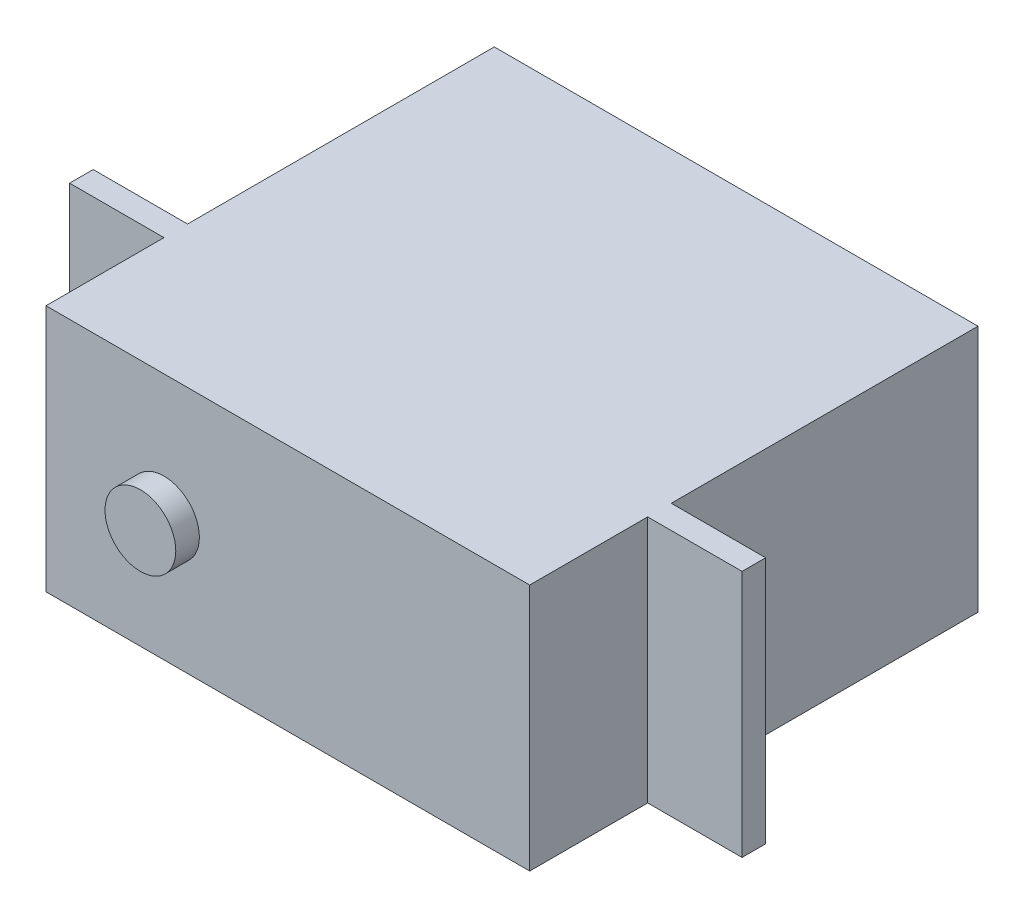
ISO-10303-21;
HEADER;
FILE_DESCRIPTION(('STEP AP214'),'2;1');
FILE_NAME('part.step','',(''),(''),'','','');
FILE_SCHEMA(('AUTOMOTIVE_DESIGN { 1 0 10303 214 1 1 1 1 }'));
ENDSEC;
DATA;
#1=APPLICATION_CONTEXT('core data for automotive mechanical design processes');
#2=APPLICATION_PROTOCOL_DEFINITION('international standard','automotive_design',2000,#1);
#3=PRODUCT_CONTEXT('',#1,'mechanical');
#4=PRODUCT('Part','Part','',(#3));
#5=PRODUCT_RELATED_PRODUCT_CATEGORY('part','',(#4));
#6=PRODUCT_DEFINITION_FORMATION('','',#4);
#7=PRODUCT_DEFINITION_CONTEXT('part definition',#1,'design');
#8=PRODUCT_DEFINITION('design','',#6,#7);
#9=PRODUCT_DEFINITION_SHAPE('','',#8);
#10=(LENGTH_UNIT() NAMED_UNIT(*) SI_UNIT(.MILLI.,.METRE.));
#11=(NAMED_UNIT(*) PLANE_ANGLE_UNIT() SI_UNIT($,.RADIAN.));
#12=(NAMED_UNIT(*) SI_UNIT($,.STERADIAN.) SOLID_ANGLE_UNIT());
#13=UNCERTAINTY_MEASURE_WITH_UNIT(LENGTH_MEASURE(1.E-05),#10,'distance_accuracy_value','');
#14=(GEOMETRIC_REPRESENTATION_CONTEXT(3) GLOBAL_UNCERTAINTY_ASSIGNED_CONTEXT((#13)) GLOBAL_UNIT_ASSIGNED_CONTEXT((#10,
#11,#12)) REPRESENTATION_CONTEXT('',''));
#15=CARTESIAN_POINT('',(0.,0.,0.));
#16=DIRECTION('',(0.,0.,1.));
#17=DIRECTION('',(1.,0.,0.));
#18=AXIS2_PLACEMENT_3D('',#15,#16,#17);
#19=CARTESIAN_POINT('',(-20.5,-10.5,32.9402739726027));
#20=DIRECTION('',(-1.,0.,0.));
#21=DIRECTION('',(0.,0.,1.));
#22=AXIS2_PLACEMENT_3D('',#19,#20,#21);
#23=PLANE('',#22);
#24=DIRECTION('',(0.,0.,1.));
#25=VECTOR('',#24,1.);
#26=CARTESIAN_POINT('',(-20.5,10.5,32.9402739726027));
#27=LINE('',#26,#25);
#28=CARTESIAN_POINT('',(-20.5,10.5,22.9402739726027));
#29=VERTEX_POINT('',#28);
#30=CARTESIAN_POINT('',(-20.5,10.5,32.9402739726027));
#31=VERTEX_POINT('',#30);
#32=EDGE_CURVE('E145',#29,#31,#27,.T.);
#33=ORIENTED_EDGE('',*,*,#32,.F.);
#34=DIRECTION('',(0.,1.,0.));
#35=VECTOR('',#34,1.);
#36=CARTESIAN_POINT('',(-20.5,-10.5,22.9402739726027));
#37=LINE('',#36,#35);
#38=CARTESIAN_POINT('',(-20.5,-10.5,22.9402739726027));
#39=VERTEX_POINT('',#38);
#40=EDGE_CURVE('E31',#39,#29,#37,.T.);
#41=ORIENTED_EDGE('',*,*,#40,.F.);
#42=DIRECTION('',(0.,0.,1.));
#43=VECTOR('',#42,1.);
#44=CARTESIAN_POINT('',(-20.5,-10.5,32.9402739726027));
#45=LINE('',#44,#43);
#46=CARTESIAN_POINT('',(-20.5,-10.5,32.9402739726027));
#47=VERTEX_POINT('',#46);
#48=EDGE_CURVE('E136',#39,#47,#45,.T.);
#49=ORIENTED_EDGE('',*,*,#48,.T.);
#50=DIRECTION('',(0.,1.,0.));
#51=VECTOR('',#50,1.);
#52=CARTESIAN_POINT('',(-20.5,-10.5,32.9402739726027));
#53=LINE('',#52,#51);
#54=EDGE_CURVE('E23',#47,#31,#53,.T.);
#55=ORIENTED_EDGE('',*,*,#54,.T.);
#56=EDGE_LOOP('',(#33,#41,#49,#55));
#57=FACE_BOUND('',#56,.T.);
#58=ADVANCED_FACE('F15',(#57),#23,.T.);
#59=CARTESIAN_POINT('',(-20.5,-10.5,32.9402739726027));
#60=DIRECTION('',(0.,0.,1.));
#61=DIRECTION('',(1.,0.,0.));
#62=AXIS2_PLACEMENT_3D('',#59,#60,#61);
#63=PLANE('',#62);
#64=CARTESIAN_POINT('',(-10.5,0.,32.9402739726027));
#65=DIRECTION('',(0.,0.,1.));
#66=DIRECTION('',(1.,0.,0.));
#67=AXIS2_PLACEMENT_3D('',#64,#65,#66);
#68=CIRCLE('',#67,3.);
#69=CARTESIAN_POINT('',(-7.5,0.,32.9402739726027));
#70=VERTEX_POINT('',#69);
#71=EDGE_CURVE('E9',#70,#70,#68,.T.);
#72=ORIENTED_EDGE('',*,*,#71,.F.);
#73=EDGE_LOOP('',(#72));
#74=FACE_BOUND('',#73,.T.);
#75=DIRECTION('',(1.,0.,0.));
#76=VECTOR('',#75,1.);
#77=CARTESIAN_POINT('',(-20.5,10.5,32.9402739726027));
#78=LINE('',#77,#76);
#79=CARTESIAN_POINT('',(20.5,10.5,32.9402739726027));
#80=VERTEX_POINT('',#79);
#81=EDGE_CURVE('E140',#31,#80,#78,.T.);
#82=ORIENTED_EDGE('',*,*,#81,.F.);
#83=ORIENTED_EDGE('',*,*,#54,.F.);
#84=DIRECTION('',(1.,0.,0.));
#85=VECTOR('',#84,1.);
#86=CARTESIAN_POINT('',(-20.5,-10.5,32.9402739726027));
#87=LINE('',#86,#85);
#88=CARTESIAN_POINT('',(20.5,-10.5,32.9402739726027));
#89=VERTEX_POINT('',#88);
#90=EDGE_CURVE('E138',#47,#89,#87,.T.);
#91=ORIENTED_EDGE('',*,*,#90,.T.);
#92=DIRECTION('',(0.,1.,0.));
#93=VECTOR('',#92,1.);
#94=CARTESIAN_POINT('',(20.5,-10.5,32.9402739726027));
#95=LINE('',#94,#93);
#96=EDGE_CURVE('E199',#89,#80,#95,.T.);
#97=ORIENTED_EDGE('',*,*,#96,.T.);
#98=EDGE_LOOP('',(#82,#83,#91,#97));
#99=FACE_BOUND('',#98,.T.);
#100=ADVANCED_FACE('F200',(#74,#99),#63,.T.);
#101=CARTESIAN_POINT('',(20.5,-10.5,32.9402739726027));
#102=DIRECTION('',(1.,0.,0.));
#103=DIRECTION('',(0.,0.,-1.));
#104=AXIS2_PLACEMENT_3D('',#101,#102,#103);
#105=PLANE('',#104);
#106=DIRECTION('',(0.,0.,-1.));
#107=VECTOR('',#106,1.);
#108=CARTESIAN_POINT('',(20.5,10.5,32.9402739726027));
#109=LINE('',#108,#107);
#110=CARTESIAN_POINT('',(20.5,10.5,22.9402739726027));
#111=VERTEX_POINT('',#110);
#112=EDGE_CURVE('E144',#80,#111,#109,.T.);
#113=ORIENTED_EDGE('',*,*,#112,.F.);
#114=ORIENTED_EDGE('',*,*,#96,.F.);
#115=DIRECTION('',(0.,0.,-1.));
#116=VECTOR('',#115,1.);
#117=CARTESIAN_POINT('',(20.5,-10.5,32.9402739726027));
#118=LINE('',#117,#116);
#119=CARTESIAN_POINT('',(20.5,-10.5,22.9402739726027));
#120=VERTEX_POINT('',#119);
#121=EDGE_CURVE('E208',#89,#120,#118,.T.);
#122=ORIENTED_EDGE('',*,*,#121,.T.);
#123=DIRECTION('',(0.,1.,0.));
#124=VECTOR('',#123,1.);
#125=CARTESIAN_POINT('',(20.5,-10.5,22.9402739726027));
#126=LINE('',#125,#124);
#127=EDGE_CURVE('E197',#120,#111,#126,.T.);
#128=ORIENTED_EDGE('',*,*,#127,.T.);
#129=EDGE_LOOP('',(#113,#114,#122,#128));
#130=FACE_BOUND('',#129,.T.);
#131=ADVANCED_FACE('F250',(#130),#105,.T.);
#132=CARTESIAN_POINT('',(20.5,-10.5,22.9402739726027));
#133=DIRECTION('',(0.,0.,1.));
#134=DIRECTION('',(1.,0.,0.));
#135=AXIS2_PLACEMENT_3D('',#132,#133,#134);
#136=PLANE('',#135);
#137=DIRECTION('',(1.,0.,0.));
#138=VECTOR('',#137,1.);
#139=CARTESIAN_POINT('',(20.5,10.5,22.9402739726027));
#140=LINE('',#139,#138);
#141=CARTESIAN_POINT('',(28.5,10.5,22.9402739726027));
#142=VERTEX_POINT('',#141);
#143=EDGE_CURVE('E149',#111,#142,#140,.T.);
#144=ORIENTED_EDGE('',*,*,#143,.F.);
#145=ORIENTED_EDGE('',*,*,#127,.F.);
#146=DIRECTION('',(1.,0.,0.));
#147=VECTOR('',#146,1.);
#148=CARTESIAN_POINT('',(20.5,-10.5,22.9402739726027));
#149=LINE('',#148,#147);
#150=CARTESIAN_POINT('',(28.5,-10.5,22.9402739726027));
#151=VERTEX_POINT('',#150);
#152=EDGE_CURVE('E210',#120,#151,#149,.T.);
#153=ORIENTED_EDGE('',*,*,#152,.T.);
#154=DIRECTION('',(0.,1.,0.));
#155=VECTOR('',#154,1.);
#156=CARTESIAN_POINT('',(28.5,-10.5,22.9402739726027));
#157=LINE('',#156,#155);
#158=EDGE_CURVE('E195',#151,#142,#157,.T.);
#159=ORIENTED_EDGE('',*,*,#158,.T.);
#160=EDGE_LOOP('',(#144,#145,#153,#159));
#161=FACE_BOUND('',#160,.T.);
#162=ADVANCED_FACE('F248',(#161),#136,.T.);
#163=CARTESIAN_POINT('',(28.5,-10.5,22.9402739726027));
#164=DIRECTION('',(1.,0.,0.));
#165=DIRECTION('',(0.,0.,-1.));
#166=AXIS2_PLACEMENT_3D('',#163,#164,#165);
#167=PLANE('',#166);
#168=DIRECTION('',(0.,0.,-1.));
#169=VECTOR('',#168,1.);
#170=CARTESIAN_POINT('',(28.5,10.5,22.9402739726027));
#171=LINE('',#170,#169);
#172=CARTESIAN_POINT('',(28.5,10.5,20.9402739726027));
#173=VERTEX_POINT('',#172);
#174=EDGE_CURVE('E153',#142,#173,#171,.T.);
#175=ORIENTED_EDGE('',*,*,#174,.F.);
#176=ORIENTED_EDGE('',*,*,#158,.F.);
#177=DIRECTION('',(0.,0.,-1.));
#178=VECTOR('',#177,1.);
#179=CARTESIAN_POINT('',(28.5,-10.5,22.9402739726027));
#180=LINE('',#179,#178);
#181=CARTESIAN_POINT('',(28.5,-10.5,20.9402739726027));
#182=VERTEX_POINT('',#181);
#183=EDGE_CURVE('E216',#151,#182,#180,.T.);
#184=ORIENTED_EDGE('',*,*,#183,.T.);
#185=DIRECTION('',(0.,1.,0.));
#186=VECTOR('',#185,1.);
#187=CARTESIAN_POINT('',(28.5,-10.5,20.9402739726027));
#188=LINE('',#187,#186);
#189=EDGE_CURVE('E193',#182,#173,#188,.T.);
#190=ORIENTED_EDGE('',*,*,#189,.T.);
#191=EDGE_LOOP('',(#175,#176,#184,#190));
#192=FACE_BOUND('',#191,.T.);
#193=ADVANCED_FACE('F245',(#192),#167,.T.);
#194=CARTESIAN_POINT('',(28.5,-10.5,20.9402739726027));
#195=DIRECTION('',(0.,0.,-1.));
#196=DIRECTION('',(-1.,0.,0.));
#197=AXIS2_PLACEMENT_3D('',#194,#195,#196);
#198=PLANE('',#197);
#199=DIRECTION('',(-1.,0.,0.));
#200=VECTOR('',#199,1.);
#201=CARTESIAN_POINT('',(28.5,10.5,20.9402739726027));
#202=LINE('',#201,#200);
#203=CARTESIAN_POINT('',(20.5,10.5,20.9402739726027));
#204=VERTEX_POINT('',#203);
#205=EDGE_CURVE('E157',#173,#204,#202,.T.);
#206=ORIENTED_EDGE('',*,*,#205,.F.);
#207=ORIENTED_EDGE('',*,*,#189,.F.);
#208=DIRECTION('',(-1.,0.,0.));
#209=VECTOR('',#208,1.);
#210=CARTESIAN_POINT('',(28.5,-10.5,20.9402739726027));
#211=LINE('',#210,#209);
#212=CARTESIAN_POINT('',(20.5,-10.5,20.9402739726027));
#213=VERTEX_POINT('',#212);
#214=EDGE_CURVE('E219',#182,#213,#211,.T.);
#215=ORIENTED_EDGE('',*,*,#214,.T.);
#216=DIRECTION('',(0.,1.,0.));
#217=VECTOR('',#216,1.);
#218=CARTESIAN_POINT('',(20.5,-10.5,20.9402739726027));
#219=LINE('',#218,#217);
#220=EDGE_CURVE('E191',#213,#204,#219,.T.);
#221=ORIENTED_EDGE('',*,*,#220,.T.);
#222=EDGE_LOOP('',(#206,#207,#215,#221));
#223=FACE_BOUND('',#222,.T.);
#224=ADVANCED_FACE('F241',(#223),#198,.T.);
#225=CARTESIAN_POINT('',(20.5,-10.5,20.9402739726027));
#226=DIRECTION('',(1.,0.,0.));
#227=DIRECTION('',(0.,0.,-1.));
#228=AXIS2_PLACEMENT_3D('',#225,#226,#227);
#229=PLANE('',#228);
#230=DIRECTION('',(0.,0.,-1.));
#231=VECTOR('',#230,1.);
#232=CARTESIAN_POINT('',(20.5,10.5,20.9402739726027));
#233=LINE('',#232,#231);
#234=CARTESIAN_POINT('',(20.5,10.5,-5.05972602739726));
#235=VERTEX_POINT('',#234);
#236=EDGE_CURVE('E161',#204,#235,#233,.T.);
#237=ORIENTED_EDGE('',*,*,#236,.F.);
#238=ORIENTED_EDGE('',*,*,#220,.F.);
#239=DIRECTION('',(0.,0.,-1.));
#240=VECTOR('',#239,1.);
#241=CARTESIAN_POINT('',(20.5,-10.5,20.9402739726027));
#242=LINE('',#241,#240);
#243=CARTESIAN_POINT('',(20.5,-10.5,-5.05972602739726));
#244=VERTEX_POINT('',#243);
#245=EDGE_CURVE('E222',#213,#244,#242,.T.);
#246=ORIENTED_EDGE('',*,*,#245,.T.);
#247=DIRECTION('',(0.,1.,0.));
#248=VECTOR('',#247,1.);
#249=CARTESIAN_POINT('',(20.5,-10.5,-5.05972602739726));
#250=LINE('',#249,#248);
#251=EDGE_CURVE('E189',#244,#235,#250,.T.);
#252=ORIENTED_EDGE('',*,*,#251,.T.);
#253=EDGE_LOOP('',(#237,#238,#246,#252));
#254=FACE_BOUND('',#253,.T.);
#255=ADVANCED_FACE('F238',(#254),#229,.T.);
#256=CARTESIAN_POINT('',(-20.5,-10.5,-5.05972602739726));
#257=DIRECTION('',(0.,0.,-1.));
#258=DIRECTION('',(-1.,0.,0.));
#259=AXIS2_PLACEMENT_3D('',#256,#257,#258);
#260=PLANE('',#259);
#261=DIRECTION('',(-1.,0.,0.));
#262=VECTOR('',#261,1.);
#263=CARTESIAN_POINT('',(-20.5,10.5,-5.05972602739726));
#264=LINE('',#263,#262);
#265=CARTESIAN_POINT('',(-20.5,10.5,-5.05972602739726));
#266=VERTEX_POINT('',#265);
#267=EDGE_CURVE('E165',#235,#266,#264,.T.);
#268=ORIENTED_EDGE('',*,*,#267,.F.);
#269=ORIENTED_EDGE('',*,*,#251,.F.);
#270=DIRECTION('',(-1.,0.,0.));
#271=VECTOR('',#270,1.);
#272=CARTESIAN_POINT('',(-20.5,-10.5,-5.05972602739726));
#273=LINE('',#272,#271);
#274=CARTESIAN_POINT('',(-20.5,-10.5,-5.05972602739726));
#275=VERTEX_POINT('',#274);
#276=EDGE_CURVE('E225',#244,#275,#273,.T.);
#277=ORIENTED_EDGE('',*,*,#276,.T.);
#278=DIRECTION('',(0.,1.,0.));
#279=VECTOR('',#278,1.);
#280=CARTESIAN_POINT('',(-20.5,-10.5,-5.05972602739726));
#281=LINE('',#280,#279);
#282=EDGE_CURVE('E187',#275,#266,#281,.T.);
#283=ORIENTED_EDGE('',*,*,#282,.T.);
#284=EDGE_LOOP('',(#268,#269,#277,#283));
#285=FACE_BOUND('',#284,.T.);
#286=ADVANCED_FACE('F235',(#285),#260,.T.);
#287=CARTESIAN_POINT('',(-20.5,-10.5,20.9402739726027));
#288=DIRECTION('',(-1.,0.,0.));
#289=DIRECTION('',(0.,0.,1.));
#290=AXIS2_PLACEMENT_3D('',#287,#288,#289);
#291=PLANE('',#290);
#292=DIRECTION('',(0.,0.,1.));
#293=VECTOR('',#292,1.);
#294=CARTESIAN_POINT('',(-20.5,10.5,20.9402739726027));
#295=LINE('',#294,#293);
#296=CARTESIAN_POINT('',(-20.5,10.5,20.9402739726027));
#297=VERTEX_POINT('',#296);
#298=EDGE_CURVE('E169',#266,#297,#295,.T.);
#299=ORIENTED_EDGE('',*,*,#298,.F.);
#300=ORIENTED_EDGE('',*,*,#282,.F.);
#301=DIRECTION('',(0.,0.,1.));
#302=VECTOR('',#301,1.);
#303=CARTESIAN_POINT('',(-20.5,-10.5,20.9402739726027));
#304=LINE('',#303,#302);
#305=CARTESIAN_POINT('',(-20.5,-10.5,20.9402739726027));
#306=VERTEX_POINT('',#305);
#307=EDGE_CURVE('E127',#275,#306,#304,.T.);
#308=ORIENTED_EDGE('',*,*,#307,.T.);
#309=DIRECTION('',(0.,1.,0.));
#310=VECTOR('',#309,1.);
#311=CARTESIAN_POINT('',(-20.5,-10.5,20.9402739726027));
#312=LINE('',#311,#310);
#313=EDGE_CURVE('E119',#306,#297,#312,.T.);
#314=ORIENTED_EDGE('',*,*,#313,.T.);
#315=EDGE_LOOP('',(#299,#300,#308,#314));
#316=FACE_BOUND('',#315,.T.);
#317=ADVANCED_FACE('F229',(#316),#291,.T.);
#318=CARTESIAN_POINT('',(-28.5,-10.5,20.9402739726027));
#319=DIRECTION('',(0.,0.,-1.));
#320=DIRECTION('',(-1.,0.,0.));
#321=AXIS2_PLACEMENT_3D('',#318,#319,#320);
#322=PLANE('',#321);
#323=DIRECTION('',(-1.,0.,0.));
#324=VECTOR('',#323,1.);
#325=CARTESIAN_POINT('',(-28.5,10.5,20.9402739726027));
#326=LINE('',#325,#324);
#327=CARTESIAN_POINT('',(-28.5,10.5,20.9402739726027));
#328=VERTEX_POINT('',#327);
#329=EDGE_CURVE('E173',#297,#328,#326,.T.);
#330=ORIENTED_EDGE('',*,*,#329,.F.);
#331=ORIENTED_EDGE('',*,*,#313,.F.);
#332=DIRECTION('',(-1.,0.,0.));
#333=VECTOR('',#332,1.);
#334=CARTESIAN_POINT('',(-28.5,-10.5,20.9402739726027));
#335=LINE('',#334,#333);
#336=CARTESIAN_POINT('',(-28.5,-10.5,20.9402739726027));
#337=VERTEX_POINT('',#336);
#338=EDGE_CURVE('E122',#306,#337,#335,.T.);
#339=ORIENTED_EDGE('',*,*,#338,.T.);
#340=DIRECTION('',(0.,1.,0.));
#341=VECTOR('',#340,1.);
#342=CARTESIAN_POINT('',(-28.5,-10.5,20.9402739726027));
#343=LINE('',#342,#341);
#344=EDGE_CURVE('E108',#337,#328,#343,.T.);
#345=ORIENTED_EDGE('',*,*,#344,.T.);
#346=EDGE_LOOP('',(#330,#331,#339,#345));
#347=FACE_BOUND('',#346,.T.);
#348=ADVANCED_FACE('F123',(#347),#322,.T.);
#349=CARTESIAN_POINT('',(-28.5,-10.5,22.9402739726027));
#350=DIRECTION('',(-1.,0.,0.));
#351=DIRECTION('',(0.,0.,1.));
#352=AXIS2_PLACEMENT_3D('',#349,#350,#351);
#353=PLANE('',#352);
#354=DIRECTION('',(0.,0.,1.));
#355=VECTOR('',#354,1.);
#356=CARTESIAN_POINT('',(-28.5,10.5,22.9402739726027));
#357=LINE('',#356,#355);
#358=CARTESIAN_POINT('',(-28.5,10.5,22.9402739726027));
#359=VERTEX_POINT('',#358);
#360=EDGE_CURVE('E115',#328,#359,#357,.T.);
#361=ORIENTED_EDGE('',*,*,#360,.F.);
#362=ORIENTED_EDGE('',*,*,#344,.F.);
#363=DIRECTION('',(0.,0.,1.));
#364=VECTOR('',#363,1.);
#365=CARTESIAN_POINT('',(-28.5,-10.5,22.9402739726027));
#366=LINE('',#365,#364);
#367=CARTESIAN_POINT('',(-28.5,-10.5,22.9402739726027));
#368=VERTEX_POINT('',#367);
#369=EDGE_CURVE('E112',#337,#368,#366,.T.);
#370=ORIENTED_EDGE('',*,*,#369,.T.);
#371=DIRECTION('',(0.,1.,0.));
#372=VECTOR('',#371,1.);
#373=CARTESIAN_POINT('',(-28.5,-10.5,22.9402739726027));
#374=LINE('',#373,#372);
#375=EDGE_CURVE('E72',#368,#359,#374,.T.);
#376=ORIENTED_EDGE('',*,*,#375,.T.);
#377=EDGE_LOOP('',(#361,#362,#370,#376));
#378=FACE_BOUND('',#377,.T.);
#379=ADVANCED_FACE('F110',(#378),#353,.T.);
#380=CARTESIAN_POINT('',(-20.5,-10.5,22.9402739726027));
#381=DIRECTION('',(0.,0.,1.));
#382=DIRECTION('',(1.,0.,0.));
#383=AXIS2_PLACEMENT_3D('',#380,#381,#382);
#384=PLANE('',#383);
#385=DIRECTION('',(1.,0.,0.));
#386=VECTOR('',#385,1.);
#387=CARTESIAN_POINT('',(-20.5,10.5,22.9402739726027));
#388=LINE('',#387,#386);
#389=EDGE_CURVE('E139',#359,#29,#388,.T.);
#390=ORIENTED_EDGE('',*,*,#389,.F.);
#391=ORIENTED_EDGE('',*,*,#375,.F.);
#392=DIRECTION('',(1.,0.,0.));
#393=VECTOR('',#392,1.);
#394=CARTESIAN_POINT('',(-20.5,-10.5,22.9402739726027));
#395=LINE('',#394,#393);
#396=EDGE_CURVE('E131',#368,#39,#395,.T.);
#397=ORIENTED_EDGE('',*,*,#396,.T.);
#398=ORIENTED_EDGE('',*,*,#40,.T.);
#399=EDGE_LOOP('',(#390,#391,#397,#398));
#400=FACE_BOUND('',#399,.T.);
#401=ADVANCED_FACE('F204',(#400),#384,.T.);
#402=CARTESIAN_POINT('',(-20.5,-10.5,32.9402739726027));
#403=DIRECTION('',(0.,1.,0.));
#404=DIRECTION('',(0.,0.,1.));
#405=AXIS2_PLACEMENT_3D('',#402,#403,#404);
#406=PLANE('',#405);
#407=ORIENTED_EDGE('',*,*,#48,.F.);
#408=ORIENTED_EDGE('',*,*,#396,.F.);
#409=ORIENTED_EDGE('',*,*,#369,.F.);
#410=ORIENTED_EDGE('',*,*,#338,.F.);
#411=ORIENTED_EDGE('',*,*,#307,.F.);
#412=ORIENTED_EDGE('',*,*,#276,.F.);
#413=ORIENTED_EDGE('',*,*,#245,.F.);
#414=ORIENTED_EDGE('',*,*,#214,.F.);
#415=ORIENTED_EDGE('',*,*,#183,.F.);
#416=ORIENTED_EDGE('',*,*,#152,.F.);
#417=ORIENTED_EDGE('',*,*,#121,.F.);
#418=ORIENTED_EDGE('',*,*,#90,.F.);
#419=EDGE_LOOP('',(#407,#408,#409,#410,#411,#412,#413,#414,#415,#416,#417,#418));
#420=FACE_BOUND('',#419,.T.);
#421=ADVANCED_FACE('F130',(#420),#406,.F.);
#422=CARTESIAN_POINT('',(-20.5,10.5,32.9402739726027));
#423=DIRECTION('',(0.,1.,0.));
#424=DIRECTION('',(0.,0.,1.));
#425=AXIS2_PLACEMENT_3D('',#422,#423,#424);
#426=PLANE('',#425);
#427=ORIENTED_EDGE('',*,*,#32,.T.);
#428=ORIENTED_EDGE('',*,*,#81,.T.);
#429=ORIENTED_EDGE('',*,*,#112,.T.);
#430=ORIENTED_EDGE('',*,*,#143,.T.);
#431=ORIENTED_EDGE('',*,*,#174,.T.);
#432=ORIENTED_EDGE('',*,*,#205,.T.);
#433=ORIENTED_EDGE('',*,*,#236,.T.);
#434=ORIENTED_EDGE('',*,*,#267,.T.);
#435=ORIENTED_EDGE('',*,*,#298,.T.);
#436=ORIENTED_EDGE('',*,*,#329,.T.);
#437=ORIENTED_EDGE('',*,*,#360,.T.);
#438=ORIENTED_EDGE('',*,*,#389,.T.);
#439=EDGE_LOOP('',(#427,#428,#429,#430,#431,#432,#433,#434,#435,#436,#437,#438));
#440=FACE_BOUND('',#439,.T.);
#441=ADVANCED_FACE('F203',(#440),#426,.T.);
#442=CARTESIAN_POINT('',(-10.5,0.,34.9402739726027));
#443=DIRECTION('',(0.,0.,-1.));
#444=DIRECTION('',(-1.,0.,0.));
#445=AXIS2_PLACEMENT_3D('',#442,#443,#444);
#446=CYLINDRICAL_SURFACE('',#445,3.);
#447=ORIENTED_EDGE('',*,*,#71,.T.);
#448=EDGE_LOOP('',(#447));
#449=FACE_BOUND('',#448,.T.);
#450=CARTESIAN_POINT('',(-10.5,0.,34.9402739726027));
#451=DIRECTION('',(0.,0.,-1.));
#452=DIRECTION('',(1.,0.,0.));
#453=AXIS2_PLACEMENT_3D('',#450,#451,#452);
#454=CIRCLE('',#453,3.);
#455=CARTESIAN_POINT('',(-7.5,0.,34.9402739726027));
#456=VERTEX_POINT('',#455);
#457=EDGE_CURVE('E183',#456,#456,#454,.T.);
#458=ORIENTED_EDGE('',*,*,#457,.T.);
#459=EDGE_LOOP('',(#458));
#460=FACE_BOUND('',#459,.T.);
#461=ADVANCED_FACE('F367',(#449,#460),#446,.T.);
#462=CARTESIAN_POINT('',(-10.5,0.,34.9402739726027));
#463=DIRECTION('',(0.,0.,-1.));
#464=DIRECTION('',(-1.,0.,0.));
#465=AXIS2_PLACEMENT_3D('',#462,#463,#464);
#466=PLANE('',#465);
#467=ORIENTED_EDGE('',*,*,#457,.F.);
#468=EDGE_LOOP('',(#467));
#469=FACE_BOUND('',#468,.T.);
#470=ADVANCED_FACE('F375',(#469),#466,.F.);
#471=CLOSED_SHELL('',(#58,#100,#131,#162,#193,#224,#255,#286,#317,#348,#379,#401,#421,#441,#461,#470));
#472=MANIFOLD_SOLID_BREP('B1',#471);
#473=ADVANCED_BREP_SHAPE_REPRESENTATION('',(#18,#472),#14);
#474=SHAPE_DEFINITION_REPRESENTATION(#9,#473);
ENDSEC;
END-ISO-10303-21;
